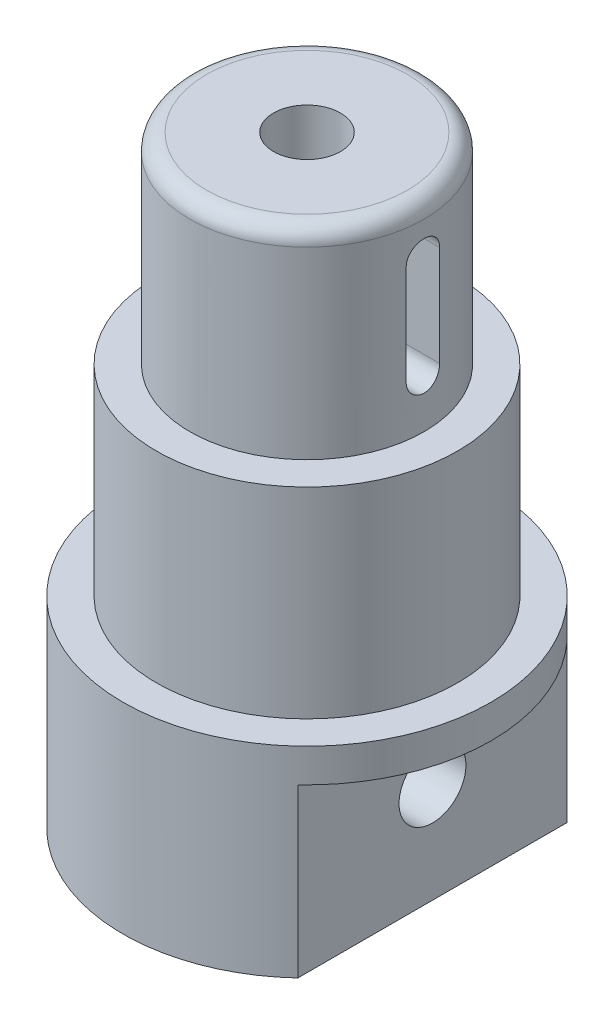
ISO-10303-21;
HEADER;
FILE_DESCRIPTION(('STEP AP214'),'2;1');
FILE_NAME('part.step','',(''),(''),'','','');
FILE_SCHEMA(('AUTOMOTIVE_DESIGN { 1 0 10303 214 1 1 1 1 }'));
ENDSEC;
DATA;
#1=APPLICATION_CONTEXT('core data for automotive mechanical design processes');
#2=APPLICATION_PROTOCOL_DEFINITION('international standard','automotive_design',2000,#1);
#3=PRODUCT_CONTEXT('',#1,'mechanical');
#4=PRODUCT('Part','Part','',(#3));
#5=PRODUCT_RELATED_PRODUCT_CATEGORY('part','',(#4));
#6=PRODUCT_DEFINITION_FORMATION('','',#4);
#7=PRODUCT_DEFINITION_CONTEXT('part definition',#1,'design');
#8=PRODUCT_DEFINITION('design','',#6,#7);
#9=PRODUCT_DEFINITION_SHAPE('','',#8);
#10=(LENGTH_UNIT() NAMED_UNIT(*) SI_UNIT(.MILLI.,.METRE.));
#11=(NAMED_UNIT(*) PLANE_ANGLE_UNIT() SI_UNIT($,.RADIAN.));
#12=(NAMED_UNIT(*) SI_UNIT($,.STERADIAN.) SOLID_ANGLE_UNIT());
#13=UNCERTAINTY_MEASURE_WITH_UNIT(LENGTH_MEASURE(1.E-05),#10,'distance_accuracy_value','');
#14=(GEOMETRIC_REPRESENTATION_CONTEXT(3) GLOBAL_UNCERTAINTY_ASSIGNED_CONTEXT((#13)) GLOBAL_UNIT_ASSIGNED_CONTEXT((#10,
#11,#12)) REPRESENTATION_CONTEXT('',''));
#15=CARTESIAN_POINT('',(0.,0.,0.));
#16=DIRECTION('',(0.,0.,1.));
#17=DIRECTION('',(1.,0.,0.));
#18=AXIS2_PLACEMENT_3D('',#15,#16,#17);
#19=CARTESIAN_POINT('',(22.,0.,0.));
#20=DIRECTION('',(0.,-1.,0.));
#21=DIRECTION('',(0.,0.,-1.));
#22=AXIS2_PLACEMENT_3D('',#19,#20,#21);
#23=PLANE('',#22);
#24=CARTESIAN_POINT('',(0.,0.,0.));
#25=DIRECTION('',(0.,-1.,0.));
#26=DIRECTION('',(0.,0.,-1.));
#27=AXIS2_PLACEMENT_3D('',#24,#25,#26);
#28=CIRCLE('',#27,4.);
#29=CARTESIAN_POINT('',(0.,0.,-4.));
#30=VERTEX_POINT('',#29);
#31=EDGE_CURVE('E279',#30,#30,#28,.T.);
#32=ORIENTED_EDGE('',*,*,#31,.F.);
#33=EDGE_LOOP('',(#32));
#34=FACE_BOUND('',#33,.T.);
#35=CARTESIAN_POINT('',(0.,0.,0.));
#36=DIRECTION('',(0.,-1.,0.));
#37=DIRECTION('',(0.,0.,-1.));
#38=AXIS2_PLACEMENT_3D('',#35,#36,#37);
#39=CIRCLE('',#38,22.);
#40=CARTESIAN_POINT('',(15.,0.,16.0934769394311));
#41=VERTEX_POINT('',#40);
#42=CARTESIAN_POINT('',(-15.,0.,16.0934769394311));
#43=VERTEX_POINT('',#42);
#44=EDGE_CURVE('E255',#41,#43,#39,.T.);
#45=ORIENTED_EDGE('',*,*,#44,.T.);
#46=DIRECTION('',(0.,0.,-1.));
#47=VECTOR('',#46,1.);
#48=CARTESIAN_POINT('',(-15.,0.,16.0934769394311));
#49=LINE('',#48,#47);
#50=CARTESIAN_POINT('',(-15.,0.,-16.0934769394311));
#51=VERTEX_POINT('',#50);
#52=EDGE_CURVE('E153',#43,#51,#49,.T.);
#53=ORIENTED_EDGE('',*,*,#52,.T.);
#54=CARTESIAN_POINT('',(15.,0.,-16.0934769394311));
#55=VERTEX_POINT('',#54);
#56=EDGE_CURVE('E158',#51,#55,#39,.T.);
#57=ORIENTED_EDGE('',*,*,#56,.T.);
#58=DIRECTION('',(0.,0.,-1.));
#59=VECTOR('',#58,1.);
#60=CARTESIAN_POINT('',(15.,0.,16.0934769394311));
#61=LINE('',#60,#59);
#62=EDGE_CURVE('E239',#41,#55,#61,.T.);
#63=ORIENTED_EDGE('',*,*,#62,.F.);
#64=EDGE_LOOP('',(#45,#53,#57,#63));
#65=FACE_BOUND('',#64,.T.);
#66=ADVANCED_FACE('F45',(#34,#65),#23,.T.);
#67=CARTESIAN_POINT('',(0.,0.,0.));
#68=DIRECTION('',(0.,-1.,0.));
#69=DIRECTION('',(0.,0.,-1.));
#70=AXIS2_PLACEMENT_3D('',#67,#68,#69);
#71=CYLINDRICAL_SURFACE('',#70,22.);
#72=CARTESIAN_POINT('',(0.,24.,0.));
#73=DIRECTION('',(0.,-1.,0.));
#74=DIRECTION('',(0.,0.,-1.));
#75=AXIS2_PLACEMENT_3D('',#72,#73,#74);
#76=CIRCLE('',#75,22.);
#77=CARTESIAN_POINT('',(0.,24.,-22.));
#78=VERTEX_POINT('',#77);
#79=EDGE_CURVE('E259',#78,#78,#76,.T.);
#80=ORIENTED_EDGE('',*,*,#79,.T.);
#81=EDGE_LOOP('',(#80));
#82=FACE_BOUND('',#81,.T.);
#83=ORIENTED_EDGE('',*,*,#56,.F.);
#84=DIRECTION('',(0.,-1.,0.));
#85=VECTOR('',#84,1.);
#86=CARTESIAN_POINT('',(-15.,20.,-16.0934769394311));
#87=LINE('',#86,#85);
#88=CARTESIAN_POINT('',(-15.,20.,-16.0934769394311));
#89=VERTEX_POINT('',#88);
#90=EDGE_CURVE('E143',#89,#51,#87,.T.);
#91=ORIENTED_EDGE('',*,*,#90,.F.);
#92=CARTESIAN_POINT('',(0.,20.,0.));
#93=DIRECTION('',(0.,1.,0.));
#94=DIRECTION('',(0.,0.,-1.));
#95=AXIS2_PLACEMENT_3D('',#92,#93,#94);
#96=CIRCLE('',#95,22.);
#97=CARTESIAN_POINT('',(-15.,20.,16.0934769394311));
#98=VERTEX_POINT('',#97);
#99=EDGE_CURVE('E148',#89,#98,#96,.T.);
#100=ORIENTED_EDGE('',*,*,#99,.T.);
#101=DIRECTION('',(0.,-1.,0.));
#102=VECTOR('',#101,1.);
#103=CARTESIAN_POINT('',(-15.,20.,16.0934769394311));
#104=LINE('',#103,#102);
#105=EDGE_CURVE('E61',#98,#43,#104,.T.);
#106=ORIENTED_EDGE('',*,*,#105,.T.);
#107=ORIENTED_EDGE('',*,*,#44,.F.);
#108=DIRECTION('',(0.,-1.,0.));
#109=VECTOR('',#108,1.);
#110=CARTESIAN_POINT('',(15.,20.,16.0934769394311));
#111=LINE('',#110,#109);
#112=CARTESIAN_POINT('',(15.,20.,16.0934769394311));
#113=VERTEX_POINT('',#112);
#114=EDGE_CURVE('E246',#113,#41,#111,.T.);
#115=ORIENTED_EDGE('',*,*,#114,.F.);
#116=CARTESIAN_POINT('',(0.,20.,0.));
#117=DIRECTION('',(0.,-1.,0.));
#118=DIRECTION('',(0.,0.,-1.));
#119=AXIS2_PLACEMENT_3D('',#116,#117,#118);
#120=CIRCLE('',#119,22.);
#121=CARTESIAN_POINT('',(15.,20.,-16.0934769394311));
#122=VERTEX_POINT('',#121);
#123=EDGE_CURVE('E240',#122,#113,#120,.T.);
#124=ORIENTED_EDGE('',*,*,#123,.F.);
#125=DIRECTION('',(0.,-1.,0.));
#126=VECTOR('',#125,1.);
#127=CARTESIAN_POINT('',(15.,20.,-16.0934769394311));
#128=LINE('',#127,#126);
#129=EDGE_CURVE('E250',#122,#55,#128,.T.);
#130=ORIENTED_EDGE('',*,*,#129,.T.);
#131=EDGE_LOOP('',(#83,#91,#100,#106,#107,#115,#124,#130));
#132=FACE_BOUND('',#131,.T.);
#133=ADVANCED_FACE('F156',(#82,#132),#71,.T.);
#134=CARTESIAN_POINT('',(15.,12.,0.));
#135=DIRECTION('',(1.,0.,0.));
#136=DIRECTION('',(0.,0.,-1.));
#137=AXIS2_PLACEMENT_3D('',#134,#135,#136);
#138=CYLINDRICAL_SURFACE('',#137,4.00000000000001);
#139=CARTESIAN_POINT('',(0.,12.,0.));
#140=DIRECTION('',(0.707106781186547,-0.707106781186547,0.));
#141=DIRECTION('',(-0.707106781186547,-0.707106781186547,0.));
#142=AXIS2_PLACEMENT_3D('',#139,#140,#141);
#143=ELLIPSE('',#142,5.65685424949239,4.00000000000001);
#144=CARTESIAN_POINT('',(0.,12.,4.00000000000001));
#145=VERTEX_POINT('',#144);
#146=CARTESIAN_POINT('',(0.,12.,-4.00000000000001));
#147=VERTEX_POINT('',#146);
#148=EDGE_CURVE('E203',#145,#147,#143,.T.);
#149=ORIENTED_EDGE('',*,*,#148,.T.);
#150=CARTESIAN_POINT('',(0.,12.,0.));
#151=DIRECTION('',(-0.707106781186547,-0.707106781186547,0.));
#152=DIRECTION('',(0.707106781186547,-0.707106781186547,0.));
#153=AXIS2_PLACEMENT_3D('',#150,#151,#152);
#154=ELLIPSE('',#153,5.65685424949239,4.00000000000001);
#155=EDGE_CURVE('E196',#147,#145,#154,.F.);
#156=ORIENTED_EDGE('',*,*,#155,.T.);
#157=EDGE_LOOP('',(#149,#156));
#158=FACE_BOUND('',#157,.T.);
#159=CARTESIAN_POINT('',(-15.,12.,0.));
#160=DIRECTION('',(-1.,0.,0.));
#161=DIRECTION('',(0.,0.,1.));
#162=AXIS2_PLACEMENT_3D('',#159,#160,#161);
#163=CIRCLE('',#162,4.00000000000001);
#164=CARTESIAN_POINT('',(-15.,12.,4.00000000000001));
#165=VERTEX_POINT('',#164);
#166=EDGE_CURVE('E162',#165,#165,#163,.F.);
#167=ORIENTED_EDGE('',*,*,#166,.F.);
#168=EDGE_LOOP('',(#167));
#169=FACE_BOUND('',#168,.T.);
#170=ADVANCED_FACE('F390',(#158,#169),#138,.F.);
#171=CARTESIAN_POINT('',(0.,0.,0.));
#172=DIRECTION('',(0.,-1.,0.));
#173=DIRECTION('',(0.,0.,-1.));
#174=AXIS2_PLACEMENT_3D('',#171,#172,#173);
#175=CYLINDRICAL_SURFACE('',#174,4.);
#176=CARTESIAN_POINT('',(0.,12.,0.));
#177=DIRECTION('',(0.707106781186547,-0.707106781186547,0.));
#178=DIRECTION('',(-0.707106781186547,-0.707106781186547,0.));
#179=AXIS2_PLACEMENT_3D('',#176,#177,#178);
#180=ELLIPSE('',#179,5.65685424949239,4.00000000000001);
#181=EDGE_CURVE('E207',#145,#147,#180,.F.);
#182=ORIENTED_EDGE('',*,*,#181,.F.);
#183=ORIENTED_EDGE('',*,*,#155,.F.);
#184=EDGE_LOOP('',(#182,#183));
#185=FACE_BOUND('',#184,.T.);
#186=CARTESIAN_POINT('',(0.,72.,0.));
#187=DIRECTION('',(0.,-1.,0.));
#188=DIRECTION('',(0.,0.,-1.));
#189=AXIS2_PLACEMENT_3D('',#186,#187,#188);
#190=CIRCLE('',#189,4.);
#191=CARTESIAN_POINT('',(0.,72.,-4.));
#192=VERTEX_POINT('',#191);
#193=EDGE_CURVE('E275',#192,#192,#190,.T.);
#194=ORIENTED_EDGE('',*,*,#193,.F.);
#195=EDGE_LOOP('',(#194));
#196=FACE_BOUND('',#195,.T.);
#197=ADVANCED_FACE('F400',(#185,#196),#175,.F.);
#198=CARTESIAN_POINT('',(0.,0.,0.));
#199=DIRECTION('',(0.,-1.,0.));
#200=DIRECTION('',(0.,0.,-1.));
#201=AXIS2_PLACEMENT_3D('',#198,#199,#200);
#202=CYLINDRICAL_SURFACE('',#201,14.);
#203=CARTESIAN_POINT('',(0.,70.,0.));
#204=DIRECTION('',(0.,1.,0.));
#205=DIRECTION('',(0.,0.,1.));
#206=AXIS2_PLACEMENT_3D('',#203,#204,#205);
#207=CIRCLE('',#206,14.);
#208=CARTESIAN_POINT('',(0.,70.,14.));
#209=VERTEX_POINT('',#208);
#210=EDGE_CURVE('E54',#209,#209,#207,.F.);
#211=ORIENTED_EDGE('',*,*,#210,.T.);
#212=EDGE_LOOP('',(#211));
#213=FACE_BOUND('',#212,.T.);
#214=CARTESIAN_POINT('',(-13.856406460551,66.,2.));
#215=CARTESIAN_POINT('',(-13.8564044885704,66.0559623433341,1.99999996848426));
#216=CARTESIAN_POINT('',(-13.8567459180978,66.1118975929903,1.99764968062703));
#217=CARTESIAN_POINT('',(-13.8580948556548,66.2233621682574,1.98827566889899));
#218=CARTESIAN_POINT('',(-13.8591023063686,66.2788915283822,1.98125234717551));
#219=CARTESIAN_POINT('',(-13.863087348327,66.4441358435776,1.95325043167293));
#220=CARTESIAN_POINT('',(-13.8670277931624,66.5527349445144,1.92533963363807));
#221=CARTESIAN_POINT('',(-13.8770319309984,66.7636426606431,1.85184847555708));
#222=CARTESIAN_POINT('',(-13.8830962290342,66.8659494735385,1.80626308004285));
#223=CARTESIAN_POINT('',(-13.8966619342044,67.0614746125607,1.69873854518983));
#224=CARTESIAN_POINT('',(-13.9041632808529,67.154693320961,1.63680009411743));
#225=CARTESIAN_POINT('',(-13.9198178460609,67.3300453534887,1.49785686647927));
#226=CARTESIAN_POINT('',(-13.927974928467,67.4121039323232,1.42075822498744));
#227=CARTESIAN_POINT('',(-13.9439882530469,67.5621743996137,1.25387603118179));
#228=CARTESIAN_POINT('',(-13.9518444491401,67.630184143455,1.16409054568492));
#229=CARTESIAN_POINT('',(-13.966410582686,67.7504909670517,0.973907589307295));
#230=CARTESIAN_POINT('',(-13.9731154139432,67.8027187949258,0.873465887541618));
#231=CARTESIAN_POINT('',(-13.9845797941416,67.8895327325221,0.665130439790596));
#232=CARTESIAN_POINT('',(-13.9893395498183,67.9241207172198,0.55723748719892));
#233=CARTESIAN_POINT('',(-13.9963504576473,67.9744489109182,0.337835383891513));
#234=CARTESIAN_POINT('',(-13.9986184489633,67.9903156910904,0.226355813854727));
#235=CARTESIAN_POINT('',(-14.0004479649409,68.0031439681544,0.00229227829243156));
#236=CARTESIAN_POINT('',(-14.0000095617107,68.0001059687368,-0.11029165772904));
#237=CARTESIAN_POINT('',(-13.9964890895687,67.9753105885634,-0.332499316606124));
#238=CARTESIAN_POINT('',(-13.9934263232301,67.9536898827705,-0.442138639702325));
#239=CARTESIAN_POINT('',(-13.9850228232183,67.8925572022312,-0.656216203301413));
#240=CARTESIAN_POINT('',(-13.979682048649,67.8530449062839,-0.760654350392187));
#241=CARTESIAN_POINT('',(-13.9672892783054,67.7571083181155,-0.961783994208321));
#242=CARTESIAN_POINT('',(-13.9602313957667,67.7006256864992,-1.05844728605718));
#243=CARTESIAN_POINT('',(-13.9451923455954,67.572396491366,-1.24097129768111));
#244=CARTESIAN_POINT('',(-13.9372111599126,67.5006496294163,-1.32683180619734));
#245=CARTESIAN_POINT('',(-13.9211332039699,67.3431771821683,-1.48611149820241));
#246=CARTESIAN_POINT('',(-13.9130360345848,67.2573341626884,-1.55941457368801));
#247=CARTESIAN_POINT('',(-13.8977050343641,67.074471745557,-1.69061330390884));
#248=CARTESIAN_POINT('',(-13.8904714559589,66.9774490962701,-1.74850445974202));
#249=CARTESIAN_POINT('',(-13.8776858672256,66.7748525720241,-1.84724843835192));
#250=CARTESIAN_POINT('',(-13.8721359515944,66.6692682504039,-1.88808006045336));
#251=CARTESIAN_POINT('',(-13.8633801720373,66.4527187361582,-1.95133985678851));
#252=CARTESIAN_POINT('',(-13.8601707904301,66.341761886904,-1.9737956550036));
#253=CARTESIAN_POINT('',(-13.857678583929,66.191657087919,-1.99116879124415));
#254=CARTESIAN_POINT('',(-13.8572019097568,66.1533681591274,-1.99448199630811));
#255=CARTESIAN_POINT('',(-13.8565662000175,66.0767249629666,-1.99889466685925));
#256=CARTESIAN_POINT('',(-13.8564066308977,66.0383709142098,-1.99999785089488));
#257=CARTESIAN_POINT('',(-13.856406460551,66.,-2.));
#258=B_SPLINE_CURVE_WITH_KNOTS('',3,(#214,#215,#216,#217,#218,#219,#220,#221,#222,#223,#224,
#225,#226,#227,#228,#229,#230,#231,#232,#233,#234,#235,#236,#237,#238,#239,#240,#241,#242,#243,
#244,#245,#246,#247,#248,#249,#250,#251,#252,#253,#254,#255,#256,#257),.UNSPECIFIED.,.F.,.F.,(4,
2,2,2,2,2,2,2,2,2,2,2,2,2,2,2,2,2,2,2,2,4),(0.,0.167783001771006,0.335551566505641,
0.670413735748165,1.0053713769381,1.34031492269815,1.67740157780393,2.01453965265996,
2.35313631388303,2.69169697745998,3.02795532452555,3.36420471250993,3.6980019604011,
4.03180520106581,4.36676935787798,4.70174006421899,5.03965791989757,5.37767430947381,
5.71610952714186,6.05403504292361,6.16929200704936,6.28435487809388),.UNSPECIFIED.);
#259=CARTESIAN_POINT('',(-13.856406460551,66.,2.));
#260=VERTEX_POINT('',#259);
#261=CARTESIAN_POINT('',(-13.856406460551,66.,-2.));
#262=VERTEX_POINT('',#261);
#263=EDGE_CURVE('E361',#260,#262,#258,.T.);
#264=ORIENTED_EDGE('',*,*,#263,.F.);
#265=DIRECTION('',(0.,-1.,0.));
#266=VECTOR('',#265,1.);
#267=CARTESIAN_POINT('',(-13.856406460551,0.,1.99999999999998));
#268=LINE('',#267,#266);
#269=CARTESIAN_POINT('',(-13.856406460551,54.,1.99999999999998));
#270=VERTEX_POINT('',#269);
#271=EDGE_CURVE('E330',#270,#260,#268,.F.);
#272=ORIENTED_EDGE('',*,*,#271,.F.);
#273=CARTESIAN_POINT('',(-13.856406460551,54.,-2.));
#274=CARTESIAN_POINT('',(-13.8564044885704,53.9440376566659,-1.99999996848426));
#275=CARTESIAN_POINT('',(-13.8567459180978,53.8881024070097,-1.99764968062703));
#276=CARTESIAN_POINT('',(-13.8580948556548,53.7766378317426,-1.98827566889899));
#277=CARTESIAN_POINT('',(-13.8591023063686,53.7211084716178,-1.98125234717551));
#278=CARTESIAN_POINT('',(-13.863087348327,53.5558641564224,-1.95325043167293));
#279=CARTESIAN_POINT('',(-13.8670277931624,53.4472650554857,-1.92533963363807));
#280=CARTESIAN_POINT('',(-13.8770319309984,53.2363573393569,-1.85184847555707));
#281=CARTESIAN_POINT('',(-13.8830962290342,53.1340505264615,-1.80626308004285));
#282=CARTESIAN_POINT('',(-13.8966619342044,52.9385253874393,-1.69873854518982));
#283=CARTESIAN_POINT('',(-13.9041632808529,52.845306679039,-1.63680009411742));
#284=CARTESIAN_POINT('',(-13.9198178460609,52.6699546465113,-1.49785686647927));
#285=CARTESIAN_POINT('',(-13.927974928467,52.5878960676768,-1.42075822498744));
#286=CARTESIAN_POINT('',(-13.9439882530469,52.4378256003863,-1.25387603118179));
#287=CARTESIAN_POINT('',(-13.9518444491401,52.369815856545,-1.16409054568492));
#288=CARTESIAN_POINT('',(-13.966410582686,52.2495090329483,-0.973907589307291));
#289=CARTESIAN_POINT('',(-13.9731154139432,52.1972812050742,-0.873465887541612));
#290=CARTESIAN_POINT('',(-13.9845797941416,52.1104672674779,-0.665130439790589));
#291=CARTESIAN_POINT('',(-13.9893395498183,52.0758792827803,-0.557237487198914));
#292=CARTESIAN_POINT('',(-13.9963504576473,52.0255510890819,-0.337835383891508));
#293=CARTESIAN_POINT('',(-13.9986184489633,52.0096843089096,-0.22635581385472));
#294=CARTESIAN_POINT('',(-14.0004479649409,51.9968560318456,-0.00229227829242204));
#295=CARTESIAN_POINT('',(-14.0000095617107,51.9998940312632,0.11029165772905));
#296=CARTESIAN_POINT('',(-13.9964890895687,52.0246894114366,0.332499316606135));
#297=CARTESIAN_POINT('',(-13.9934263232301,52.0463101172295,0.442138639702335));
#298=CARTESIAN_POINT('',(-13.9850228232183,52.1074427977688,0.656216203301423));
#299=CARTESIAN_POINT('',(-13.979682048649,52.1469550937161,0.760654350392198));
#300=CARTESIAN_POINT('',(-13.9672892783054,52.2428916818845,0.961783994208333));
#301=CARTESIAN_POINT('',(-13.9602313957667,52.2993743135008,1.0584472860572));
#302=CARTESIAN_POINT('',(-13.9451923455954,52.427603508634,1.24097129768112));
#303=CARTESIAN_POINT('',(-13.9372111599126,52.4993503705837,1.32683180619735));
#304=CARTESIAN_POINT('',(-13.9211332039699,52.6568228178317,1.48611149820242));
#305=CARTESIAN_POINT('',(-13.9130360345848,52.7426658373117,1.55941457368802));
#306=CARTESIAN_POINT('',(-13.8977050343641,52.925528254443,1.69061330390885));
#307=CARTESIAN_POINT('',(-13.8904714559589,53.02255090373,1.74850445974203));
#308=CARTESIAN_POINT('',(-13.8776858672256,53.2251474279759,1.84724843835193));
#309=CARTESIAN_POINT('',(-13.8721359515944,53.3307317495961,1.88808006045336));
#310=CARTESIAN_POINT('',(-13.8633801720373,53.5472812638419,1.95133985678851));
#311=CARTESIAN_POINT('',(-13.8601707904301,53.6582381130961,1.97379565500361));
#312=CARTESIAN_POINT('',(-13.857678583929,53.8083429120811,1.99116879124415));
#313=CARTESIAN_POINT('',(-13.8572019097568,53.8466318408726,1.99448199630811));
#314=CARTESIAN_POINT('',(-13.8565662000175,53.9232750370335,1.99889466685925));
#315=CARTESIAN_POINT('',(-13.8564066308977,53.9616290857902,1.99999785089488));
#316=CARTESIAN_POINT('',(-13.856406460551,54.,2.));
#317=B_SPLINE_CURVE_WITH_KNOTS('',3,(#273,#274,#275,#276,#277,#278,#279,#280,#281,#282,#283,
#284,#285,#286,#287,#288,#289,#290,#291,#292,#293,#294,#295,#296,#297,#298,#299,#300,#301,#302,
#303,#304,#305,#306,#307,#308,#309,#310,#311,#312,#313,#314,#315,#316),.UNSPECIFIED.,.F.,.F.,(4,
2,2,2,2,2,2,2,2,2,2,2,2,2,2,2,2,2,2,2,2,4),(0.,0.16778300177102,0.335551566505655,
0.670413735748173,1.00537137693811,1.34031492269816,1.67740157780393,2.01453965265997,
2.35313631388303,2.69169697745999,3.02795532452556,3.36420471250995,3.69800196040111,
4.03180520106582,4.366769357878,4.70174006421899,5.03965791989758,5.37767430947382,
5.71610952714188,6.05403504292362,6.16929200704938,6.28435487809389),.UNSPECIFIED.);
#318=CARTESIAN_POINT('',(-13.856406460551,54.,-2.));
#319=VERTEX_POINT('',#318);
#320=EDGE_CURVE('E333',#319,#270,#317,.T.);
#321=ORIENTED_EDGE('',*,*,#320,.F.);
#322=DIRECTION('',(0.,-1.,0.));
#323=VECTOR('',#322,1.);
#324=CARTESIAN_POINT('',(-13.856406460551,0.,-2.00000000000002));
#325=LINE('',#324,#323);
#326=EDGE_CURVE('E341',#262,#319,#325,.T.);
#327=ORIENTED_EDGE('',*,*,#326,.F.);
#328=EDGE_LOOP('',(#264,#272,#321,#327));
#329=FACE_BOUND('',#328,.T.);
#330=CARTESIAN_POINT('',(0.,48.,0.));
#331=DIRECTION('',(0.,-1.,0.));
#332=DIRECTION('',(0.,0.,-1.));
#333=AXIS2_PLACEMENT_3D('',#330,#331,#332);
#334=CIRCLE('',#333,14.);
#335=CARTESIAN_POINT('',(0.,48.,-14.));
#336=VERTEX_POINT('',#335);
#337=EDGE_CURVE('E271',#336,#336,#334,.T.);
#338=ORIENTED_EDGE('',*,*,#337,.F.);
#339=EDGE_LOOP('',(#338));
#340=FACE_BOUND('',#339,.T.);
#341=DIRECTION('',(0.,-1.,0.));
#342=VECTOR('',#341,1.);
#343=CARTESIAN_POINT('',(13.856406460551,0.,1.99999999999998));
#344=LINE('',#343,#342);
#345=CARTESIAN_POINT('',(13.856406460551,54.,2.));
#346=VERTEX_POINT('',#345);
#347=CARTESIAN_POINT('',(13.856406460551,66.,2.));
#348=VERTEX_POINT('',#347);
#349=EDGE_CURVE('E297',#346,#348,#344,.F.);
#350=ORIENTED_EDGE('',*,*,#349,.T.);
#351=CARTESIAN_POINT('',(13.856406460551,66.,2.));
#352=CARTESIAN_POINT('',(13.8564044885704,66.0559623433341,1.99999996848426));
#353=CARTESIAN_POINT('',(13.8567459180978,66.1118975929903,1.99764968062703));
#354=CARTESIAN_POINT('',(13.8580948556548,66.2233621682574,1.98827566889899));
#355=CARTESIAN_POINT('',(13.8591023063686,66.2788915283822,1.98125234717551));
#356=CARTESIAN_POINT('',(13.863087348327,66.4441358435776,1.95325043167293));
#357=CARTESIAN_POINT('',(13.8670277931624,66.5527349445144,1.92533963363807));
#358=CARTESIAN_POINT('',(13.8770319309984,66.7636426606431,1.85184847555708));
#359=CARTESIAN_POINT('',(13.8830962290342,66.8659494735385,1.80626308004285));
#360=CARTESIAN_POINT('',(13.8966619342044,67.0614746125607,1.69873854518983));
#361=CARTESIAN_POINT('',(13.9041632808529,67.154693320961,1.63680009411743));
#362=CARTESIAN_POINT('',(13.9198178460609,67.3300453534887,1.49785686647927));
#363=CARTESIAN_POINT('',(13.927974928467,67.4121039323232,1.42075822498744));
#364=CARTESIAN_POINT('',(13.9439882530469,67.5621743996137,1.25387603118179));
#365=CARTESIAN_POINT('',(13.9518444491401,67.630184143455,1.16409054568492));
#366=CARTESIAN_POINT('',(13.966410582686,67.7504909670517,0.973907589307295));
#367=CARTESIAN_POINT('',(13.9731154139432,67.8027187949258,0.873465887541618));
#368=CARTESIAN_POINT('',(13.9845797941416,67.8895327325221,0.665130439790596));
#369=CARTESIAN_POINT('',(13.9893395498183,67.9241207172198,0.55723748719892));
#370=CARTESIAN_POINT('',(13.9963504576473,67.9744489109182,0.337835383891513));
#371=CARTESIAN_POINT('',(13.9986184489633,67.9903156910904,0.226355813854727));
#372=CARTESIAN_POINT('',(14.0004479649409,68.0031439681544,0.00229227829243156));
#373=CARTESIAN_POINT('',(14.0000095617107,68.0001059687368,-0.11029165772904));
#374=CARTESIAN_POINT('',(13.9964890895687,67.9753105885634,-0.332499316606124));
#375=CARTESIAN_POINT('',(13.9934263232301,67.9536898827705,-0.442138639702325));
#376=CARTESIAN_POINT('',(13.9850228232183,67.8925572022312,-0.656216203301413));
#377=CARTESIAN_POINT('',(13.979682048649,67.8530449062839,-0.760654350392187));
#378=CARTESIAN_POINT('',(13.9672892783054,67.7571083181155,-0.961783994208321));
#379=CARTESIAN_POINT('',(13.9602313957667,67.7006256864992,-1.05844728605718));
#380=CARTESIAN_POINT('',(13.9451923455954,67.572396491366,-1.24097129768111));
#381=CARTESIAN_POINT('',(13.9372111599126,67.5006496294163,-1.32683180619734));
#382=CARTESIAN_POINT('',(13.9211332039699,67.3431771821683,-1.48611149820241));
#383=CARTESIAN_POINT('',(13.9130360345848,67.2573341626884,-1.55941457368801));
#384=CARTESIAN_POINT('',(13.8977050343641,67.074471745557,-1.69061330390884));
#385=CARTESIAN_POINT('',(13.8904714559589,66.9774490962701,-1.74850445974202));
#386=CARTESIAN_POINT('',(13.8776858672256,66.7748525720241,-1.84724843835192));
#387=CARTESIAN_POINT('',(13.8721359515944,66.6692682504039,-1.88808006045336));
#388=CARTESIAN_POINT('',(13.8633801720373,66.4527187361582,-1.95133985678851));
#389=CARTESIAN_POINT('',(13.8601707904301,66.341761886904,-1.9737956550036));
#390=CARTESIAN_POINT('',(13.857678583929,66.191657087919,-1.99116879124415));
#391=CARTESIAN_POINT('',(13.8572019097568,66.1533681591274,-1.99448199630811));
#392=CARTESIAN_POINT('',(13.8565662000175,66.0767249629666,-1.99889466685925));
#393=CARTESIAN_POINT('',(13.8564066308977,66.0383709142098,-1.99999785089488));
#394=CARTESIAN_POINT('',(13.856406460551,66.,-2.));
#395=B_SPLINE_CURVE_WITH_KNOTS('',3,(#351,#352,#353,#354,#355,#356,#357,#358,#359,#360,#361,
#362,#363,#364,#365,#366,#367,#368,#369,#370,#371,#372,#373,#374,#375,#376,#377,#378,#379,#380,
#381,#382,#383,#384,#385,#386,#387,#388,#389,#390,#391,#392,#393,#394),.UNSPECIFIED.,.F.,.F.,(4,
2,2,2,2,2,2,2,2,2,2,2,2,2,2,2,2,2,2,2,2,4),(0.,0.167783001771006,0.335551566505641,
0.670413735748165,1.0053713769381,1.34031492269815,1.67740157780393,2.01453965265996,
2.35313631388303,2.69169697745998,3.02795532452555,3.36420471250993,3.6980019604011,
4.03180520106581,4.36676935787798,4.70174006421899,5.03965791989757,5.37767430947381,
5.71610952714186,6.05403504292361,6.16929200704936,6.28435487809388),.UNSPECIFIED.);
#396=CARTESIAN_POINT('',(13.856406460551,66.,-2.));
#397=VERTEX_POINT('',#396);
#398=EDGE_CURVE('E322',#348,#397,#395,.T.);
#399=ORIENTED_EDGE('',*,*,#398,.T.);
#400=DIRECTION('',(0.,-1.,0.));
#401=VECTOR('',#400,1.);
#402=CARTESIAN_POINT('',(13.856406460551,0.,-2.00000000000002));
#403=LINE('',#402,#401);
#404=CARTESIAN_POINT('',(13.856406460551,54.,-2.00000000000002));
#405=VERTEX_POINT('',#404);
#406=EDGE_CURVE('E283',#397,#405,#403,.T.);
#407=ORIENTED_EDGE('',*,*,#406,.T.);
#408=CARTESIAN_POINT('',(13.856406460551,54.,-2.));
#409=CARTESIAN_POINT('',(13.8564044885704,53.9440376566659,-1.99999996848426));
#410=CARTESIAN_POINT('',(13.8567459180978,53.8881024070097,-1.99764968062703));
#411=CARTESIAN_POINT('',(13.8580948556548,53.7766378317426,-1.98827566889899));
#412=CARTESIAN_POINT('',(13.8591023063686,53.7211084716178,-1.98125234717551));
#413=CARTESIAN_POINT('',(13.863087348327,53.5558641564224,-1.95325043167293));
#414=CARTESIAN_POINT('',(13.8670277931624,53.4472650554857,-1.92533963363807));
#415=CARTESIAN_POINT('',(13.8770319309984,53.2363573393569,-1.85184847555707));
#416=CARTESIAN_POINT('',(13.8830962290342,53.1340505264615,-1.80626308004285));
#417=CARTESIAN_POINT('',(13.8966619342044,52.9385253874393,-1.69873854518982));
#418=CARTESIAN_POINT('',(13.9041632808529,52.845306679039,-1.63680009411742));
#419=CARTESIAN_POINT('',(13.9198178460609,52.6699546465113,-1.49785686647927));
#420=CARTESIAN_POINT('',(13.927974928467,52.5878960676768,-1.42075822498744));
#421=CARTESIAN_POINT('',(13.9439882530469,52.4378256003863,-1.25387603118179));
#422=CARTESIAN_POINT('',(13.9518444491401,52.369815856545,-1.16409054568492));
#423=CARTESIAN_POINT('',(13.966410582686,52.2495090329483,-0.973907589307291));
#424=CARTESIAN_POINT('',(13.9731154139432,52.1972812050742,-0.873465887541612));
#425=CARTESIAN_POINT('',(13.9845797941416,52.1104672674779,-0.665130439790589));
#426=CARTESIAN_POINT('',(13.9893395498183,52.0758792827803,-0.557237487198914));
#427=CARTESIAN_POINT('',(13.9963504576473,52.0255510890819,-0.337835383891508));
#428=CARTESIAN_POINT('',(13.9986184489633,52.0096843089096,-0.22635581385472));
#429=CARTESIAN_POINT('',(14.0004479649409,51.9968560318456,-0.00229227829242204));
#430=CARTESIAN_POINT('',(14.0000095617107,51.9998940312632,0.11029165772905));
#431=CARTESIAN_POINT('',(13.9964890895687,52.0246894114366,0.332499316606135));
#432=CARTESIAN_POINT('',(13.9934263232301,52.0463101172295,0.442138639702335));
#433=CARTESIAN_POINT('',(13.9850228232183,52.1074427977688,0.656216203301423));
#434=CARTESIAN_POINT('',(13.979682048649,52.1469550937161,0.760654350392198));
#435=CARTESIAN_POINT('',(13.9672892783054,52.2428916818845,0.961783994208333));
#436=CARTESIAN_POINT('',(13.9602313957667,52.2993743135008,1.0584472860572));
#437=CARTESIAN_POINT('',(13.9451923455954,52.427603508634,1.24097129768112));
#438=CARTESIAN_POINT('',(13.9372111599126,52.4993503705837,1.32683180619735));
#439=CARTESIAN_POINT('',(13.9211332039699,52.6568228178317,1.48611149820242));
#440=CARTESIAN_POINT('',(13.9130360345848,52.7426658373117,1.55941457368802));
#441=CARTESIAN_POINT('',(13.8977050343641,52.925528254443,1.69061330390885));
#442=CARTESIAN_POINT('',(13.8904714559589,53.02255090373,1.74850445974203));
#443=CARTESIAN_POINT('',(13.8776858672256,53.2251474279759,1.84724843835193));
#444=CARTESIAN_POINT('',(13.8721359515944,53.3307317495961,1.88808006045336));
#445=CARTESIAN_POINT('',(13.8633801720373,53.5472812638419,1.95133985678851));
#446=CARTESIAN_POINT('',(13.8601707904301,53.6582381130961,1.97379565500361));
#447=CARTESIAN_POINT('',(13.857678583929,53.8083429120811,1.99116879124415));
#448=CARTESIAN_POINT('',(13.8572019097568,53.8466318408726,1.99448199630811));
#449=CARTESIAN_POINT('',(13.8565662000175,53.9232750370335,1.99889466685925));
#450=CARTESIAN_POINT('',(13.8564066308977,53.9616290857902,1.99999785089488));
#451=CARTESIAN_POINT('',(13.856406460551,54.,2.));
#452=B_SPLINE_CURVE_WITH_KNOTS('',3,(#408,#409,#410,#411,#412,#413,#414,#415,#416,#417,#418,
#419,#420,#421,#422,#423,#424,#425,#426,#427,#428,#429,#430,#431,#432,#433,#434,#435,#436,#437,
#438,#439,#440,#441,#442,#443,#444,#445,#446,#447,#448,#449,#450,#451),.UNSPECIFIED.,.F.,.F.,(4,
2,2,2,2,2,2,2,2,2,2,2,2,2,2,2,2,2,2,2,2,4),(0.,0.16778300177102,0.335551566505655,
0.670413735748173,1.00537137693811,1.34031492269816,1.67740157780393,2.01453965265997,
2.35313631388303,2.69169697745999,3.02795532452556,3.36420471250995,3.69800196040111,
4.03180520106582,4.366769357878,4.70174006421899,5.03965791989758,5.37767430947382,
5.71610952714188,6.05403504292362,6.16929200704938,6.28435487809389),.UNSPECIFIED.);
#453=EDGE_CURVE('E287',#405,#346,#452,.T.);
#454=ORIENTED_EDGE('',*,*,#453,.T.);
#455=EDGE_LOOP('',(#350,#399,#407,#454));
#456=FACE_BOUND('',#455,.T.);
#457=ADVANCED_FACE('F299',(#213,#329,#340,#456),#202,.T.);
#458=ORIENTED_EDGE('',*,*,#148,.F.);
#459=CARTESIAN_POINT('',(0.,12.,0.));
#460=DIRECTION('',(-0.707106781186547,-0.707106781186547,0.));
#461=DIRECTION('',(0.707106781186547,-0.707106781186547,0.));
#462=AXIS2_PLACEMENT_3D('',#459,#460,#461);
#463=ELLIPSE('',#462,5.65685424949239,4.00000000000001);
#464=EDGE_CURVE('E200',#147,#145,#463,.T.);
#465=ORIENTED_EDGE('',*,*,#464,.F.);
#466=EDGE_LOOP('',(#458,#465));
#467=FACE_BOUND('',#466,.T.);
#468=ORIENTED_EDGE('',*,*,#31,.T.);
#469=EDGE_LOOP('',(#468));
#470=FACE_BOUND('',#469,.T.);
#471=ADVANCED_FACE('F396',(#467,#470),#175,.F.);
#472=CARTESIAN_POINT('',(4.,72.,0.));
#473=DIRECTION('',(0.,1.,0.));
#474=DIRECTION('',(0.,0.,1.));
#475=AXIS2_PLACEMENT_3D('',#472,#473,#474);
#476=PLANE('',#475);
#477=CARTESIAN_POINT('',(0.,72.,0.));
#478=DIRECTION('',(0.,1.,0.));
#479=DIRECTION('',(0.,0.,1.));
#480=AXIS2_PLACEMENT_3D('',#477,#478,#479);
#481=CIRCLE('',#480,12.);
#482=CARTESIAN_POINT('',(0.,72.,12.));
#483=VERTEX_POINT('',#482);
#484=EDGE_CURVE('E11',#483,#483,#481,.T.);
#485=ORIENTED_EDGE('',*,*,#484,.T.);
#486=EDGE_LOOP('',(#485));
#487=FACE_BOUND('',#486,.T.);
#488=ORIENTED_EDGE('',*,*,#193,.T.);
#489=EDGE_LOOP('',(#488));
#490=FACE_BOUND('',#489,.T.);
#491=ADVANCED_FACE('F398',(#487,#490),#476,.T.);
#492=CARTESIAN_POINT('',(14.,48.,0.));
#493=DIRECTION('',(0.,1.,0.));
#494=DIRECTION('',(0.,0.,1.));
#495=AXIS2_PLACEMENT_3D('',#492,#493,#494);
#496=PLANE('',#495);
#497=ORIENTED_EDGE('',*,*,#337,.T.);
#498=EDGE_LOOP('',(#497));
#499=FACE_BOUND('',#498,.T.);
#500=CARTESIAN_POINT('',(0.,48.,0.));
#501=DIRECTION('',(0.,-1.,0.));
#502=DIRECTION('',(0.,0.,-1.));
#503=AXIS2_PLACEMENT_3D('',#500,#501,#502);
#504=CIRCLE('',#503,18.);
#505=CARTESIAN_POINT('',(0.,48.,-18.));
#506=VERTEX_POINT('',#505);
#507=EDGE_CURVE('E267',#506,#506,#504,.T.);
#508=ORIENTED_EDGE('',*,*,#507,.F.);
#509=EDGE_LOOP('',(#508));
#510=FACE_BOUND('',#509,.T.);
#511=ADVANCED_FACE('F401',(#499,#510),#496,.T.);
#512=CARTESIAN_POINT('',(0.,0.,0.));
#513=DIRECTION('',(0.,-1.,0.));
#514=DIRECTION('',(0.,0.,-1.));
#515=AXIS2_PLACEMENT_3D('',#512,#513,#514);
#516=CYLINDRICAL_SURFACE('',#515,18.);
#517=ORIENTED_EDGE('',*,*,#507,.T.);
#518=EDGE_LOOP('',(#517));
#519=FACE_BOUND('',#518,.T.);
#520=CARTESIAN_POINT('',(0.,24.,0.));
#521=DIRECTION('',(0.,-1.,0.));
#522=DIRECTION('',(0.,0.,-1.));
#523=AXIS2_PLACEMENT_3D('',#520,#521,#522);
#524=CIRCLE('',#523,18.);
#525=CARTESIAN_POINT('',(0.,24.,-18.));
#526=VERTEX_POINT('',#525);
#527=EDGE_CURVE('E263',#526,#526,#524,.T.);
#528=ORIENTED_EDGE('',*,*,#527,.F.);
#529=EDGE_LOOP('',(#528));
#530=FACE_BOUND('',#529,.T.);
#531=ADVANCED_FACE('F407',(#519,#530),#516,.T.);
#532=CARTESIAN_POINT('',(18.,24.,0.));
#533=DIRECTION('',(0.,1.,0.));
#534=DIRECTION('',(0.,0.,1.));
#535=AXIS2_PLACEMENT_3D('',#532,#533,#534);
#536=PLANE('',#535);
#537=ORIENTED_EDGE('',*,*,#527,.T.);
#538=EDGE_LOOP('',(#537));
#539=FACE_BOUND('',#538,.T.);
#540=ORIENTED_EDGE('',*,*,#79,.F.);
#541=EDGE_LOOP('',(#540));
#542=FACE_BOUND('',#541,.T.);
#543=ADVANCED_FACE('F465',(#539,#542),#536,.T.);
#544=CARTESIAN_POINT('',(15.,20.,16.0934769394311));
#545=DIRECTION('',(-1.,0.,0.));
#546=DIRECTION('',(0.,0.,1.));
#547=AXIS2_PLACEMENT_3D('',#544,#545,#546);
#548=PLANE('',#547);
#549=CARTESIAN_POINT('',(15.,12.,0.));
#550=DIRECTION('',(1.,0.,0.));
#551=DIRECTION('',(0.,0.,-1.));
#552=AXIS2_PLACEMENT_3D('',#549,#550,#551);
#553=CIRCLE('',#552,4.00000000000001);
#554=CARTESIAN_POINT('',(15.,12.,-4.00000000000001));
#555=VERTEX_POINT('',#554);
#556=EDGE_CURVE('E192',#555,#555,#553,.T.);
#557=ORIENTED_EDGE('',*,*,#556,.F.);
#558=EDGE_LOOP('',(#557));
#559=FACE_BOUND('',#558,.T.);
#560=ORIENTED_EDGE('',*,*,#62,.T.);
#561=ORIENTED_EDGE('',*,*,#129,.F.);
#562=DIRECTION('',(0.,0.,-1.));
#563=VECTOR('',#562,1.);
#564=CARTESIAN_POINT('',(15.,20.,16.0934769394311));
#565=LINE('',#564,#563);
#566=EDGE_CURVE('E243',#113,#122,#565,.T.);
#567=ORIENTED_EDGE('',*,*,#566,.F.);
#568=ORIENTED_EDGE('',*,*,#114,.T.);
#569=EDGE_LOOP('',(#560,#561,#567,#568));
#570=FACE_BOUND('',#569,.T.);
#571=ADVANCED_FACE('F455',(#559,#570),#548,.F.);
#572=CARTESIAN_POINT('',(0.,20.,0.));
#573=DIRECTION('',(0.,-1.,0.));
#574=DIRECTION('',(0.,0.,-1.));
#575=AXIS2_PLACEMENT_3D('',#572,#573,#574);
#576=PLANE('',#575);
#577=ORIENTED_EDGE('',*,*,#123,.T.);
#578=ORIENTED_EDGE('',*,*,#566,.T.);
#579=EDGE_LOOP('',(#577,#578));
#580=FACE_BOUND('',#579,.T.);
#581=ADVANCED_FACE('F319',(#580),#576,.T.);
#582=CARTESIAN_POINT('',(29.,66.,0.));
#583=DIRECTION('',(-1.,0.,0.));
#584=DIRECTION('',(0.,0.,1.));
#585=AXIS2_PLACEMENT_3D('',#582,#583,#584);
#586=CYLINDRICAL_SURFACE('',#585,2.);
#587=DIRECTION('',(-1.,0.,0.));
#588=VECTOR('',#587,1.);
#589=CARTESIAN_POINT('',(29.,66.,2.));
#590=LINE('',#589,#588);
#591=CARTESIAN_POINT('',(9.,66.,2.));
#592=VERTEX_POINT('',#591);
#593=EDGE_CURVE('E236',#348,#592,#590,.T.);
#594=ORIENTED_EDGE('',*,*,#593,.T.);
#595=CARTESIAN_POINT('',(9.,66.,0.));
#596=DIRECTION('',(1.,0.,0.));
#597=DIRECTION('',(0.,0.,-1.));
#598=AXIS2_PLACEMENT_3D('',#595,#596,#597);
#599=CIRCLE('',#598,2.);
#600=CARTESIAN_POINT('',(9.,66.,-2.));
#601=VERTEX_POINT('',#600);
#602=EDGE_CURVE('E211',#601,#592,#599,.T.);
#603=ORIENTED_EDGE('',*,*,#602,.F.);
#604=DIRECTION('',(-1.,0.,0.));
#605=VECTOR('',#604,1.);
#606=CARTESIAN_POINT('',(29.,66.,-2.));
#607=LINE('',#606,#605);
#608=EDGE_CURVE('E227',#397,#601,#607,.T.);
#609=ORIENTED_EDGE('',*,*,#608,.F.);
#610=ORIENTED_EDGE('',*,*,#398,.F.);
#611=EDGE_LOOP('',(#594,#603,#609,#610));
#612=FACE_BOUND('',#611,.T.);
#613=ADVANCED_FACE('F314',(#612),#586,.F.);
#614=CARTESIAN_POINT('',(29.,66.,2.));
#615=DIRECTION('',(0.,0.,-1.));
#616=DIRECTION('',(0.,1.,0.));
#617=AXIS2_PLACEMENT_3D('',#614,#615,#616);
#618=PLANE('',#617);
#619=DIRECTION('',(-1.,0.,0.));
#620=VECTOR('',#619,1.);
#621=CARTESIAN_POINT('',(29.,54.,2.));
#622=LINE('',#621,#620);
#623=CARTESIAN_POINT('',(9.,54.,2.));
#624=VERTEX_POINT('',#623);
#625=EDGE_CURVE('E233',#346,#624,#622,.T.);
#626=ORIENTED_EDGE('',*,*,#625,.T.);
#627=DIRECTION('',(0.,-1.,0.));
#628=VECTOR('',#627,1.);
#629=CARTESIAN_POINT('',(9.,66.,2.));
#630=LINE('',#629,#628);
#631=EDGE_CURVE('E215',#592,#624,#630,.T.);
#632=ORIENTED_EDGE('',*,*,#631,.F.);
#633=ORIENTED_EDGE('',*,*,#593,.F.);
#634=ORIENTED_EDGE('',*,*,#349,.F.);
#635=EDGE_LOOP('',(#626,#632,#633,#634));
#636=FACE_BOUND('',#635,.T.);
#637=ADVANCED_FACE('F309',(#636),#618,.T.);
#638=CARTESIAN_POINT('',(29.,54.,0.));
#639=DIRECTION('',(-1.,0.,0.));
#640=DIRECTION('',(0.,0.,1.));
#641=AXIS2_PLACEMENT_3D('',#638,#639,#640);
#642=CYLINDRICAL_SURFACE('',#641,2.);
#643=DIRECTION('',(-1.,0.,0.));
#644=VECTOR('',#643,1.);
#645=CARTESIAN_POINT('',(29.,54.,-2.));
#646=LINE('',#645,#644);
#647=CARTESIAN_POINT('',(9.,54.,-2.));
#648=VERTEX_POINT('',#647);
#649=EDGE_CURVE('E230',#405,#648,#646,.T.);
#650=ORIENTED_EDGE('',*,*,#649,.T.);
#651=CARTESIAN_POINT('',(9.,54.,0.));
#652=DIRECTION('',(1.,0.,0.));
#653=DIRECTION('',(0.,0.,-1.));
#654=AXIS2_PLACEMENT_3D('',#651,#652,#653);
#655=CIRCLE('',#654,2.);
#656=EDGE_CURVE('E219',#624,#648,#655,.T.);
#657=ORIENTED_EDGE('',*,*,#656,.F.);
#658=ORIENTED_EDGE('',*,*,#625,.F.);
#659=ORIENTED_EDGE('',*,*,#453,.F.);
#660=EDGE_LOOP('',(#650,#657,#658,#659));
#661=FACE_BOUND('',#660,.T.);
#662=ADVANCED_FACE('F303',(#661),#642,.F.);
#663=CARTESIAN_POINT('',(29.,66.,-2.));
#664=DIRECTION('',(0.,0.,1.));
#665=DIRECTION('',(0.,-1.,0.));
#666=AXIS2_PLACEMENT_3D('',#663,#664,#665);
#667=PLANE('',#666);
#668=ORIENTED_EDGE('',*,*,#608,.T.);
#669=DIRECTION('',(0.,1.,0.));
#670=VECTOR('',#669,1.);
#671=CARTESIAN_POINT('',(9.,66.,-2.));
#672=LINE('',#671,#670);
#673=EDGE_CURVE('E223',#648,#601,#672,.T.);
#674=ORIENTED_EDGE('',*,*,#673,.F.);
#675=ORIENTED_EDGE('',*,*,#649,.F.);
#676=ORIENTED_EDGE('',*,*,#406,.F.);
#677=EDGE_LOOP('',(#668,#674,#675,#676));
#678=FACE_BOUND('',#677,.T.);
#679=ADVANCED_FACE('F308',(#678),#667,.T.);
#680=CARTESIAN_POINT('',(9.,66.,0.));
#681=DIRECTION('',(1.,0.,0.));
#682=DIRECTION('',(0.,0.,-1.));
#683=AXIS2_PLACEMENT_3D('',#680,#681,#682);
#684=PLANE('',#683);
#685=ORIENTED_EDGE('',*,*,#602,.T.);
#686=ORIENTED_EDGE('',*,*,#631,.T.);
#687=ORIENTED_EDGE('',*,*,#656,.T.);
#688=ORIENTED_EDGE('',*,*,#673,.T.);
#689=EDGE_LOOP('',(#685,#686,#687,#688));
#690=FACE_BOUND('',#689,.T.);
#691=ADVANCED_FACE('F532',(#690),#684,.T.);
#692=ORIENTED_EDGE('',*,*,#181,.T.);
#693=ORIENTED_EDGE('',*,*,#464,.T.);
#694=EDGE_LOOP('',(#692,#693));
#695=FACE_BOUND('',#694,.T.);
#696=ORIENTED_EDGE('',*,*,#556,.T.);
#697=EDGE_LOOP('',(#696));
#698=FACE_BOUND('',#697,.T.);
#699=ADVANCED_FACE('F359',(#695,#698),#138,.F.);
#700=CARTESIAN_POINT('',(-29.,66.,0.));
#701=DIRECTION('',(1.,0.,0.));
#702=DIRECTION('',(0.,0.,-1.));
#703=AXIS2_PLACEMENT_3D('',#700,#701,#702);
#704=CYLINDRICAL_SURFACE('',#703,2.);
#705=ORIENTED_EDGE('',*,*,#263,.T.);
#706=DIRECTION('',(1.,0.,0.));
#707=VECTOR('',#706,1.);
#708=CARTESIAN_POINT('',(-29.,66.,-2.));
#709=LINE('',#708,#707);
#710=CARTESIAN_POINT('',(-9.,66.,-2.));
#711=VERTEX_POINT('',#710);
#712=EDGE_CURVE('E189',#262,#711,#709,.T.);
#713=ORIENTED_EDGE('',*,*,#712,.T.);
#714=CARTESIAN_POINT('',(-9.,66.,0.));
#715=DIRECTION('',(1.,0.,0.));
#716=DIRECTION('',(0.,0.,-1.));
#717=AXIS2_PLACEMENT_3D('',#714,#715,#716);
#718=CIRCLE('',#717,2.);
#719=CARTESIAN_POINT('',(-9.,66.,2.));
#720=VERTEX_POINT('',#719);
#721=EDGE_CURVE('E166',#711,#720,#718,.T.);
#722=ORIENTED_EDGE('',*,*,#721,.T.);
#723=DIRECTION('',(1.,0.,0.));
#724=VECTOR('',#723,1.);
#725=CARTESIAN_POINT('',(-29.,66.,2.));
#726=LINE('',#725,#724);
#727=EDGE_CURVE('E181',#260,#720,#726,.T.);
#728=ORIENTED_EDGE('',*,*,#727,.F.);
#729=EDGE_LOOP('',(#705,#713,#722,#728));
#730=FACE_BOUND('',#729,.T.);
#731=ADVANCED_FACE('F354',(#730),#704,.F.);
#732=CARTESIAN_POINT('',(-29.,66.,-2.));
#733=DIRECTION('',(0.,0.,-1.));
#734=DIRECTION('',(0.,1.,0.));
#735=AXIS2_PLACEMENT_3D('',#732,#733,#734);
#736=PLANE('',#735);
#737=ORIENTED_EDGE('',*,*,#326,.T.);
#738=DIRECTION('',(1.,0.,0.));
#739=VECTOR('',#738,1.);
#740=CARTESIAN_POINT('',(-29.,54.,-2.));
#741=LINE('',#740,#739);
#742=CARTESIAN_POINT('',(-9.,54.,-2.));
#743=VERTEX_POINT('',#742);
#744=EDGE_CURVE('E186',#319,#743,#741,.T.);
#745=ORIENTED_EDGE('',*,*,#744,.T.);
#746=DIRECTION('',(0.,1.,0.));
#747=VECTOR('',#746,1.);
#748=CARTESIAN_POINT('',(-9.,66.,-2.));
#749=LINE('',#748,#747);
#750=EDGE_CURVE('E170',#743,#711,#749,.T.);
#751=ORIENTED_EDGE('',*,*,#750,.T.);
#752=ORIENTED_EDGE('',*,*,#712,.F.);
#753=EDGE_LOOP('',(#737,#745,#751,#752));
#754=FACE_BOUND('',#753,.T.);
#755=ADVANCED_FACE('F349',(#754),#736,.F.);
#756=CARTESIAN_POINT('',(-29.,54.,0.));
#757=DIRECTION('',(1.,0.,0.));
#758=DIRECTION('',(0.,0.,-1.));
#759=AXIS2_PLACEMENT_3D('',#756,#757,#758);
#760=CYLINDRICAL_SURFACE('',#759,2.);
#761=ORIENTED_EDGE('',*,*,#320,.T.);
#762=DIRECTION('',(1.,0.,0.));
#763=VECTOR('',#762,1.);
#764=CARTESIAN_POINT('',(-29.,54.,2.));
#765=LINE('',#764,#763);
#766=CARTESIAN_POINT('',(-9.,54.,2.));
#767=VERTEX_POINT('',#766);
#768=EDGE_CURVE('E69',#270,#767,#765,.T.);
#769=ORIENTED_EDGE('',*,*,#768,.T.);
#770=CARTESIAN_POINT('',(-9.,54.,0.));
#771=DIRECTION('',(1.,0.,0.));
#772=DIRECTION('',(0.,0.,-1.));
#773=AXIS2_PLACEMENT_3D('',#770,#771,#772);
#774=CIRCLE('',#773,2.);
#775=EDGE_CURVE('E174',#767,#743,#774,.T.);
#776=ORIENTED_EDGE('',*,*,#775,.T.);
#777=ORIENTED_EDGE('',*,*,#744,.F.);
#778=EDGE_LOOP('',(#761,#769,#776,#777));
#779=FACE_BOUND('',#778,.T.);
#780=ADVANCED_FACE('F343',(#779),#760,.F.);
#781=CARTESIAN_POINT('',(-29.,66.,2.));
#782=DIRECTION('',(0.,0.,1.));
#783=DIRECTION('',(0.,-1.,0.));
#784=AXIS2_PLACEMENT_3D('',#781,#782,#783);
#785=PLANE('',#784);
#786=ORIENTED_EDGE('',*,*,#271,.T.);
#787=ORIENTED_EDGE('',*,*,#727,.T.);
#788=DIRECTION('',(0.,-1.,0.));
#789=VECTOR('',#788,1.);
#790=CARTESIAN_POINT('',(-9.,66.,2.));
#791=LINE('',#790,#789);
#792=EDGE_CURVE('E178',#720,#767,#791,.T.);
#793=ORIENTED_EDGE('',*,*,#792,.T.);
#794=ORIENTED_EDGE('',*,*,#768,.F.);
#795=EDGE_LOOP('',(#786,#787,#793,#794));
#796=FACE_BOUND('',#795,.T.);
#797=ADVANCED_FACE('F348',(#796),#785,.F.);
#798=CARTESIAN_POINT('',(-9.,66.,0.));
#799=DIRECTION('',(-1.,0.,0.));
#800=DIRECTION('',(0.,0.,-1.));
#801=AXIS2_PLACEMENT_3D('',#798,#799,#800);
#802=PLANE('',#801);
#803=ORIENTED_EDGE('',*,*,#721,.F.);
#804=ORIENTED_EDGE('',*,*,#750,.F.);
#805=ORIENTED_EDGE('',*,*,#775,.F.);
#806=ORIENTED_EDGE('',*,*,#792,.F.);
#807=EDGE_LOOP('',(#803,#804,#805,#806));
#808=FACE_BOUND('',#807,.T.);
#809=ADVANCED_FACE('F427',(#808),#802,.T.);
#810=CARTESIAN_POINT('',(-15.,20.,16.0934769394311));
#811=DIRECTION('',(-1.,0.,0.));
#812=DIRECTION('',(0.,0.,1.));
#813=AXIS2_PLACEMENT_3D('',#810,#811,#812);
#814=PLANE('',#813);
#815=ORIENTED_EDGE('',*,*,#52,.F.);
#816=ORIENTED_EDGE('',*,*,#105,.F.);
#817=DIRECTION('',(0.,0.,-1.));
#818=VECTOR('',#817,1.);
#819=CARTESIAN_POINT('',(-15.,20.,16.0934769394311));
#820=LINE('',#819,#818);
#821=EDGE_CURVE('E138',#98,#89,#820,.T.);
#822=ORIENTED_EDGE('',*,*,#821,.T.);
#823=ORIENTED_EDGE('',*,*,#90,.T.);
#824=EDGE_LOOP('',(#815,#816,#822,#823));
#825=FACE_BOUND('',#824,.T.);
#826=ORIENTED_EDGE('',*,*,#166,.T.);
#827=EDGE_LOOP('',(#826));
#828=FACE_BOUND('',#827,.T.);
#829=ADVANCED_FACE('F140',(#825,#828),#814,.T.);
#830=CARTESIAN_POINT('',(0.,20.,0.));
#831=DIRECTION('',(0.,-1.,0.));
#832=DIRECTION('',(0.,0.,-1.));
#833=AXIS2_PLACEMENT_3D('',#830,#831,#832);
#834=PLANE('',#833);
#835=ORIENTED_EDGE('',*,*,#99,.F.);
#836=ORIENTED_EDGE('',*,*,#821,.F.);
#837=EDGE_LOOP('',(#835,#836));
#838=FACE_BOUND('',#837,.T.);
#839=ADVANCED_FACE('F150',(#838),#834,.T.);
#840=CARTESIAN_POINT('',(0.,70.,0.));
#841=DIRECTION('',(0.,1.,0.));
#842=DIRECTION('',(0.,0.,1.));
#843=AXIS2_PLACEMENT_3D('',#840,#841,#842);
#844=TOROIDAL_SURFACE('',#843,12.,2.);
#845=ORIENTED_EDGE('',*,*,#484,.F.);
#846=EDGE_LOOP('',(#845));
#847=FACE_BOUND('',#846,.T.);
#848=ORIENTED_EDGE('',*,*,#210,.F.);
#849=EDGE_LOOP('',(#848));
#850=FACE_BOUND('',#849,.T.);
#851=ADVANCED_FACE('F47',(#847,#850),#844,.T.);
#852=CLOSED_SHELL('',(#66,#133,#170,#197,#457,#471,#491,#511,#531,#543,#571,#581,#613,#637,#662,
#679,#691,#699,#731,#755,#780,#797,#809,#829,#839,#851));
#853=MANIFOLD_SOLID_BREP('B2',#852);
#854=ADVANCED_BREP_SHAPE_REPRESENTATION('',(#18,#853),#14);
#855=SHAPE_DEFINITION_REPRESENTATION(#9,#854);
ENDSEC;
END-ISO-10303-21;
